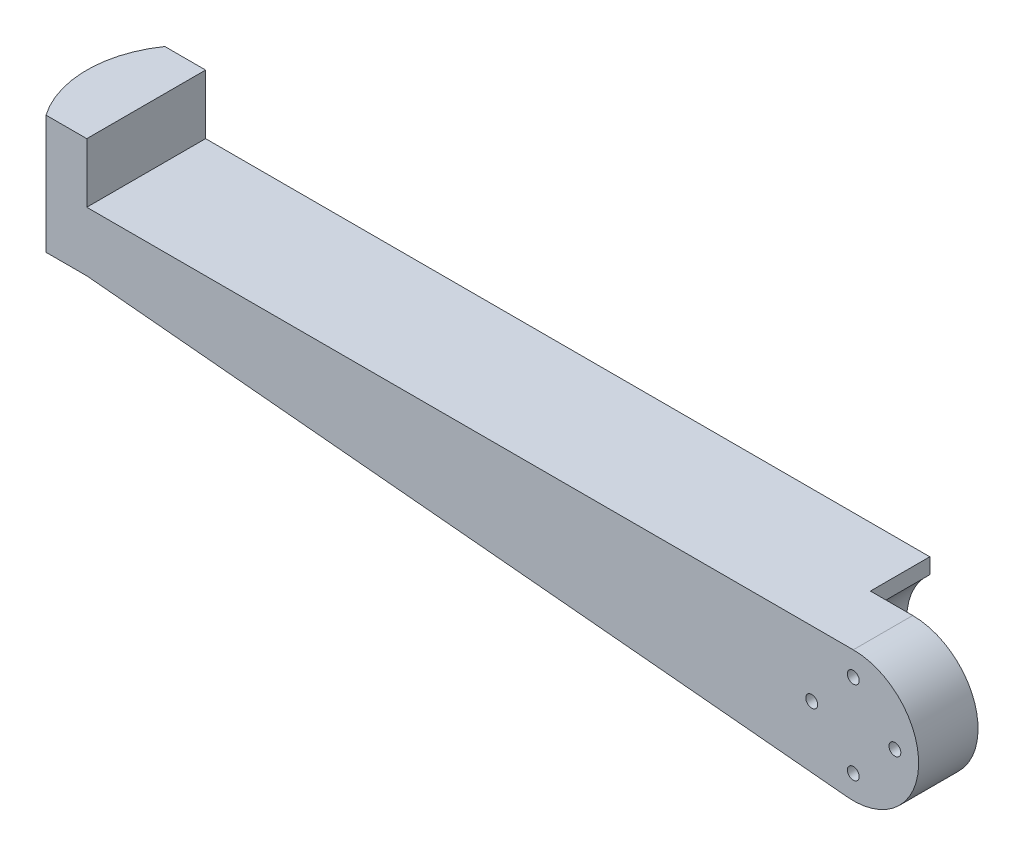
ISO-10303-21;
HEADER;
FILE_DESCRIPTION(('STEP AP214'),'2;1');
FILE_NAME('part.step','',(''),(''),'','','');
FILE_SCHEMA(('AUTOMOTIVE_DESIGN { 1 0 10303 214 1 1 1 1 }'));
ENDSEC;
DATA;
#1=APPLICATION_CONTEXT('core data for automotive mechanical design processes');
#2=APPLICATION_PROTOCOL_DEFINITION('international standard','automotive_design',2000,#1);
#3=PRODUCT_CONTEXT('',#1,'mechanical');
#4=PRODUCT('Part','Part','',(#3));
#5=PRODUCT_RELATED_PRODUCT_CATEGORY('part','',(#4));
#6=PRODUCT_DEFINITION_FORMATION('','',#4);
#7=PRODUCT_DEFINITION_CONTEXT('part definition',#1,'design');
#8=PRODUCT_DEFINITION('design','',#6,#7);
#9=PRODUCT_DEFINITION_SHAPE('','',#8);
#10=(LENGTH_UNIT() NAMED_UNIT(*) SI_UNIT(.MILLI.,.METRE.));
#11=(NAMED_UNIT(*) PLANE_ANGLE_UNIT() SI_UNIT($,.RADIAN.));
#12=(NAMED_UNIT(*) SI_UNIT($,.STERADIAN.) SOLID_ANGLE_UNIT());
#13=UNCERTAINTY_MEASURE_WITH_UNIT(LENGTH_MEASURE(1.E-05),#10,'distance_accuracy_value','');
#14=(GEOMETRIC_REPRESENTATION_CONTEXT(3) GLOBAL_UNCERTAINTY_ASSIGNED_CONTEXT((#13)) GLOBAL_UNIT_ASSIGNED_CONTEXT((#10,
#11,#12)) REPRESENTATION_CONTEXT('',''));
#15=CARTESIAN_POINT('',(0.,0.,0.));
#16=DIRECTION('',(0.,0.,1.));
#17=DIRECTION('',(1.,0.,0.));
#18=AXIS2_PLACEMENT_3D('',#15,#16,#17);
#19=CARTESIAN_POINT('',(-139.,0.999999999999987,-10.));
#20=DIRECTION('',(0.,-1.,0.));
#21=DIRECTION('',(0.,0.,-1.));
#22=AXIS2_PLACEMENT_3D('',#19,#20,#21);
#23=PLANE('',#22);
#24=DIRECTION('',(1.,0.,0.));
#25=VECTOR('',#24,1.);
#26=CARTESIAN_POINT('',(-139.,0.999999999999987,10.));
#27=LINE('',#26,#25);
#28=CARTESIAN_POINT('',(-135.861406616345,0.999999999999987,10.));
#29=VERTEX_POINT('',#28);
#30=CARTESIAN_POINT('',(-129.,0.999999999999987,10.));
#31=VERTEX_POINT('',#30);
#32=EDGE_CURVE('E132',#29,#31,#27,.T.);
#33=ORIENTED_EDGE('',*,*,#32,.F.);
#34=CARTESIAN_POINT('',(-121.5,0.999999999999987,0.));
#35=DIRECTION('',(0.,-1.,0.));
#36=DIRECTION('',(0.,0.,-1.));
#37=AXIS2_PLACEMENT_3D('',#34,#35,#36);
#38=CIRCLE('',#37,17.5);
#39=CARTESIAN_POINT('',(-135.861406616345,0.999999999999987,-10.));
#40=VERTEX_POINT('',#39);
#41=EDGE_CURVE('E120',#29,#40,#38,.T.);
#42=ORIENTED_EDGE('',*,*,#41,.T.);
#43=DIRECTION('',(1.,0.,0.));
#44=VECTOR('',#43,1.);
#45=CARTESIAN_POINT('',(-139.,0.999999999999987,-10.));
#46=LINE('',#45,#44);
#47=CARTESIAN_POINT('',(-129.,0.999999999999987,-10.));
#48=VERTEX_POINT('',#47);
#49=EDGE_CURVE('E228',#40,#48,#46,.T.);
#50=ORIENTED_EDGE('',*,*,#49,.T.);
#51=DIRECTION('',(0.,0.,1.));
#52=VECTOR('',#51,1.);
#53=CARTESIAN_POINT('',(-129.,0.999999999999987,-10.));
#54=LINE('',#53,#52);
#55=EDGE_CURVE('E139',#48,#31,#54,.T.);
#56=ORIENTED_EDGE('',*,*,#55,.T.);
#57=EDGE_LOOP('',(#33,#42,#50,#56));
#58=FACE_BOUND('',#57,.T.);
#59=ADVANCED_FACE('F39',(#58),#23,.T.);
#60=CARTESIAN_POINT('',(-129.,21.,-10.));
#61=DIRECTION('',(0.,1.,0.));
#62=DIRECTION('',(-1.,0.,0.));
#63=AXIS2_PLACEMENT_3D('',#60,#61,#62);
#64=PLANE('',#63);
#65=CARTESIAN_POINT('',(-121.5,21.,0.));
#66=DIRECTION('',(0.,-1.,0.));
#67=DIRECTION('',(-1.,0.,0.));
#68=AXIS2_PLACEMENT_3D('',#65,#66,#67);
#69=CIRCLE('',#68,17.5);
#70=CARTESIAN_POINT('',(-135.861406616345,21.,10.));
#71=VERTEX_POINT('',#70);
#72=CARTESIAN_POINT('',(-135.861406616345,21.,-10.));
#73=VERTEX_POINT('',#72);
#74=EDGE_CURVE('E54',#71,#73,#69,.T.);
#75=ORIENTED_EDGE('',*,*,#74,.F.);
#76=DIRECTION('',(-1.,0.,0.));
#77=VECTOR('',#76,1.);
#78=CARTESIAN_POINT('',(-129.,21.,10.));
#79=LINE('',#78,#77);
#80=CARTESIAN_POINT('',(-129.,21.,10.));
#81=VERTEX_POINT('',#80);
#82=EDGE_CURVE('E136',#81,#71,#79,.T.);
#83=ORIENTED_EDGE('',*,*,#82,.F.);
#84=DIRECTION('',(0.,0.,1.));
#85=VECTOR('',#84,1.);
#86=CARTESIAN_POINT('',(-129.,21.,-10.));
#87=LINE('',#86,#85);
#88=CARTESIAN_POINT('',(-129.,21.,-10.));
#89=VERTEX_POINT('',#88);
#90=EDGE_CURVE('E151',#89,#81,#87,.T.);
#91=ORIENTED_EDGE('',*,*,#90,.F.);
#92=DIRECTION('',(-1.,0.,0.));
#93=VECTOR('',#92,1.);
#94=CARTESIAN_POINT('',(-129.,21.,-10.));
#95=LINE('',#94,#93);
#96=EDGE_CURVE('E225',#89,#73,#95,.T.);
#97=ORIENTED_EDGE('',*,*,#96,.T.);
#98=EDGE_LOOP('',(#75,#83,#91,#97));
#99=FACE_BOUND('',#98,.T.);
#100=ADVANCED_FACE('F240',(#99),#64,.T.);
#101=CARTESIAN_POINT('',(0.,0.,10.));
#102=DIRECTION('',(0.,0.,1.));
#103=DIRECTION('',(1.,0.,0.));
#104=AXIS2_PLACEMENT_3D('',#101,#102,#103);
#105=PLANE('',#104);
#106=CARTESIAN_POINT('',(0.,-7.,10.));
#107=DIRECTION('',(0.,0.,1.));
#108=DIRECTION('',(1.,0.,0.));
#109=AXIS2_PLACEMENT_3D('',#106,#107,#108);
#110=CIRCLE('',#109,1.);
#111=CARTESIAN_POINT('',(0.999999999999951,-7.,10.));
#112=VERTEX_POINT('',#111);
#113=EDGE_CURVE('E162',#112,#112,#110,.T.);
#114=ORIENTED_EDGE('',*,*,#113,.F.);
#115=EDGE_LOOP('',(#114));
#116=FACE_BOUND('',#115,.T.);
#117=CARTESIAN_POINT('',(0.,7.,10.));
#118=DIRECTION('',(0.,0.,1.));
#119=DIRECTION('',(1.,0.,0.));
#120=AXIS2_PLACEMENT_3D('',#117,#118,#119);
#121=CIRCLE('',#120,1.);
#122=CARTESIAN_POINT('',(1.,7.,10.));
#123=VERTEX_POINT('',#122);
#124=EDGE_CURVE('E174',#123,#123,#121,.T.);
#125=ORIENTED_EDGE('',*,*,#124,.F.);
#126=EDGE_LOOP('',(#125));
#127=FACE_BOUND('',#126,.T.);
#128=CARTESIAN_POINT('',(7.,0.,10.));
#129=DIRECTION('',(0.,0.,1.));
#130=DIRECTION('',(1.,0.,0.));
#131=AXIS2_PLACEMENT_3D('',#128,#129,#130);
#132=CIRCLE('',#131,1.);
#133=CARTESIAN_POINT('',(8.,0.,10.));
#134=VERTEX_POINT('',#133);
#135=EDGE_CURVE('E168',#134,#134,#132,.T.);
#136=ORIENTED_EDGE('',*,*,#135,.F.);
#137=EDGE_LOOP('',(#136));
#138=FACE_BOUND('',#137,.T.);
#139=CARTESIAN_POINT('',(-7.,0.,10.));
#140=DIRECTION('',(0.,0.,1.));
#141=DIRECTION('',(1.,0.,0.));
#142=AXIS2_PLACEMENT_3D('',#139,#140,#141);
#143=CIRCLE('',#142,1.);
#144=CARTESIAN_POINT('',(-6.,0.,10.));
#145=VERTEX_POINT('',#144);
#146=EDGE_CURVE('E156',#145,#145,#143,.T.);
#147=ORIENTED_EDGE('',*,*,#146,.F.);
#148=EDGE_LOOP('',(#147));
#149=FACE_BOUND('',#148,.T.);
#150=ORIENTED_EDGE('',*,*,#82,.T.);
#151=DIRECTION('',(0.,1.,0.));
#152=VECTOR('',#151,1.);
#153=CARTESIAN_POINT('',(-135.861406616345,-9.48097173109072,10.));
#154=LINE('',#153,#152);
#155=EDGE_CURVE('E123',#29,#71,#154,.T.);
#156=ORIENTED_EDGE('',*,*,#155,.F.);
#157=ORIENTED_EDGE('',*,*,#32,.T.);
#158=DIRECTION('',(0.995667073768571,-0.092989667238516,0.));
#159=VECTOR('',#158,1.);
#160=CARTESIAN_POINT('',(-129.,0.999999999999987,10.));
#161=LINE('',#160,#159);
#162=CARTESIAN_POINT('',(-1.02288633962367,-10.9523378114543,10.));
#163=VERTEX_POINT('',#162);
#164=EDGE_CURVE('E141',#31,#163,#161,.T.);
#165=ORIENTED_EDGE('',*,*,#164,.T.);
#166=CARTESIAN_POINT('',(0.,0.,10.));
#167=DIRECTION('',(0.,0.,1.));
#168=DIRECTION('',(1.,0.,0.));
#169=AXIS2_PLACEMENT_3D('',#166,#167,#168);
#170=CIRCLE('',#169,11.);
#171=CARTESIAN_POINT('',(0.,11.,10.));
#172=VERTEX_POINT('',#171);
#173=EDGE_CURVE('E180',#163,#172,#170,.T.);
#174=ORIENTED_EDGE('',*,*,#173,.T.);
#175=DIRECTION('',(-1.,0.,0.));
#176=VECTOR('',#175,1.);
#177=CARTESIAN_POINT('',(0.,11.,10.));
#178=LINE('',#177,#176);
#179=CARTESIAN_POINT('',(-129.,11.,10.));
#180=VERTEX_POINT('',#179);
#181=EDGE_CURVE('E194',#172,#180,#178,.T.);
#182=ORIENTED_EDGE('',*,*,#181,.T.);
#183=DIRECTION('',(0.,1.,0.));
#184=VECTOR('',#183,1.);
#185=CARTESIAN_POINT('',(-129.,11.,10.));
#186=LINE('',#185,#184);
#187=EDGE_CURVE('E145',#180,#81,#186,.T.);
#188=ORIENTED_EDGE('',*,*,#187,.T.);
#189=EDGE_LOOP('',(#150,#156,#157,#165,#174,#182,#188));
#190=FACE_BOUND('',#189,.T.);
#191=ADVANCED_FACE('F131',(#116,#127,#138,#149,#190),#105,.T.);
#192=CARTESIAN_POINT('',(0.,0.,0.));
#193=DIRECTION('',(0.,0.,1.));
#194=DIRECTION('',(1.,0.,0.));
#195=AXIS2_PLACEMENT_3D('',#192,#193,#194);
#196=PLANE('',#195);
#197=CARTESIAN_POINT('',(0.,0.,0.));
#198=DIRECTION('',(0.,0.,1.));
#199=DIRECTION('',(1.,0.,0.));
#200=AXIS2_PLACEMENT_3D('',#197,#198,#199);
#201=CIRCLE('',#200,11.);
#202=CARTESIAN_POINT('',(-7.12256812039605,8.38266206943343,0.));
#203=VERTEX_POINT('',#202);
#204=CARTESIAN_POINT('',(-7.12256812039605,-8.38266206943343,0.));
#205=VERTEX_POINT('',#204);
#206=EDGE_CURVE('E183',#203,#205,#201,.T.);
#207=ORIENTED_EDGE('',*,*,#206,.F.);
#208=DIRECTION('',(0.,1.,0.));
#209=VECTOR('',#208,1.);
#210=CARTESIAN_POINT('',(-7.12256812039605,11.,0.));
#211=LINE('',#210,#209);
#212=CARTESIAN_POINT('',(-7.12256812039605,11.,0.));
#213=VERTEX_POINT('',#212);
#214=EDGE_CURVE('E207',#203,#213,#211,.T.);
#215=ORIENTED_EDGE('',*,*,#214,.T.);
#216=DIRECTION('',(1.,0.,0.));
#217=VECTOR('',#216,1.);
#218=CARTESIAN_POINT('',(0.,11.,0.));
#219=LINE('',#218,#217);
#220=CARTESIAN_POINT('',(0.,11.,0.));
#221=VERTEX_POINT('',#220);
#222=EDGE_CURVE('E192',#213,#221,#219,.T.);
#223=ORIENTED_EDGE('',*,*,#222,.T.);
#224=CARTESIAN_POINT('',(-1.02288633962367,-10.9523378114543,0.));
#225=VERTEX_POINT('',#224);
#226=EDGE_CURVE('E177',#225,#221,#201,.T.);
#227=ORIENTED_EDGE('',*,*,#226,.F.);
#228=DIRECTION('',(-0.995667073768572,0.0929896672385145,0.));
#229=VECTOR('',#228,1.);
#230=CARTESIAN_POINT('',(-1.02288633962367,-10.9523378114543,0.));
#231=LINE('',#230,#229);
#232=CARTESIAN_POINT('',(-7.12256812039605,-10.3826620694334,0.));
#233=VERTEX_POINT('',#232);
#234=EDGE_CURVE('E205',#225,#233,#231,.T.);
#235=ORIENTED_EDGE('',*,*,#234,.T.);
#236=DIRECTION('',(0.,1.,0.));
#237=VECTOR('',#236,1.);
#238=CARTESIAN_POINT('',(-7.12256812039605,-8.38266206943343,0.));
#239=LINE('',#238,#237);
#240=EDGE_CURVE('E246',#233,#205,#239,.T.);
#241=ORIENTED_EDGE('',*,*,#240,.T.);
#242=EDGE_LOOP('',(#207,#215,#223,#227,#235,#241));
#243=FACE_BOUND('',#242,.T.);
#244=CARTESIAN_POINT('',(0.,7.,0.));
#245=DIRECTION('',(0.,0.,1.));
#246=DIRECTION('',(1.,0.,0.));
#247=AXIS2_PLACEMENT_3D('',#244,#245,#246);
#248=CIRCLE('',#247,1.);
#249=CARTESIAN_POINT('',(1.,7.,0.));
#250=VERTEX_POINT('',#249);
#251=EDGE_CURVE('E171',#250,#250,#248,.T.);
#252=ORIENTED_EDGE('',*,*,#251,.T.);
#253=EDGE_LOOP('',(#252));
#254=FACE_BOUND('',#253,.T.);
#255=CARTESIAN_POINT('',(7.,0.,0.));
#256=DIRECTION('',(0.,0.,1.));
#257=DIRECTION('',(1.,0.,0.));
#258=AXIS2_PLACEMENT_3D('',#255,#256,#257);
#259=CIRCLE('',#258,1.);
#260=CARTESIAN_POINT('',(8.,0.,0.));
#261=VERTEX_POINT('',#260);
#262=EDGE_CURVE('E165',#261,#261,#259,.T.);
#263=ORIENTED_EDGE('',*,*,#262,.T.);
#264=EDGE_LOOP('',(#263));
#265=FACE_BOUND('',#264,.T.);
#266=CARTESIAN_POINT('',(0.,-7.,0.));
#267=DIRECTION('',(0.,0.,1.));
#268=DIRECTION('',(1.,0.,0.));
#269=AXIS2_PLACEMENT_3D('',#266,#267,#268);
#270=CIRCLE('',#269,1.);
#271=CARTESIAN_POINT('',(0.999999999999951,-7.,0.));
#272=VERTEX_POINT('',#271);
#273=EDGE_CURVE('E159',#272,#272,#270,.T.);
#274=ORIENTED_EDGE('',*,*,#273,.T.);
#275=EDGE_LOOP('',(#274));
#276=FACE_BOUND('',#275,.T.);
#277=CARTESIAN_POINT('',(-7.,0.,0.));
#278=DIRECTION('',(0.,0.,1.));
#279=DIRECTION('',(1.,0.,0.));
#280=AXIS2_PLACEMENT_3D('',#277,#278,#279);
#281=CIRCLE('',#280,1.);
#282=CARTESIAN_POINT('',(-6.,0.,0.));
#283=VERTEX_POINT('',#282);
#284=EDGE_CURVE('E150',#283,#283,#281,.T.);
#285=ORIENTED_EDGE('',*,*,#284,.T.);
#286=EDGE_LOOP('',(#285));
#287=FACE_BOUND('',#286,.T.);
#288=ADVANCED_FACE('F202',(#243,#254,#265,#276,#287),#196,.F.);
#289=CARTESIAN_POINT('',(0.,0.,10.));
#290=DIRECTION('',(0.,0.,-1.));
#291=DIRECTION('',(-1.,0.,0.));
#292=AXIS2_PLACEMENT_3D('',#289,#290,#291);
#293=CYLINDRICAL_SURFACE('',#292,11.);
#294=ORIENTED_EDGE('',*,*,#173,.F.);
#295=DIRECTION('',(0.,0.,-1.));
#296=VECTOR('',#295,1.);
#297=CARTESIAN_POINT('',(-1.02288633962368,-10.9523378114543,10.));
#298=LINE('',#297,#296);
#299=EDGE_CURVE('E11',#163,#225,#298,.T.);
#300=ORIENTED_EDGE('',*,*,#299,.T.);
#301=ORIENTED_EDGE('',*,*,#226,.T.);
#302=DIRECTION('',(0.,0.,-1.));
#303=VECTOR('',#302,1.);
#304=CARTESIAN_POINT('',(0.,11.,10.));
#305=LINE('',#304,#303);
#306=EDGE_CURVE('E47',#172,#221,#305,.T.);
#307=ORIENTED_EDGE('',*,*,#306,.F.);
#308=EDGE_LOOP('',(#294,#300,#301,#307));
#309=FACE_BOUND('',#308,.T.);
#310=ADVANCED_FACE('F41',(#309),#293,.T.);
#311=CARTESIAN_POINT('',(0.,7.,10.));
#312=DIRECTION('',(0.,0.,-1.));
#313=DIRECTION('',(-1.,0.,0.));
#314=AXIS2_PLACEMENT_3D('',#311,#312,#313);
#315=CYLINDRICAL_SURFACE('',#314,1.);
#316=ORIENTED_EDGE('',*,*,#124,.T.);
#317=EDGE_LOOP('',(#316));
#318=FACE_BOUND('',#317,.T.);
#319=ORIENTED_EDGE('',*,*,#251,.F.);
#320=EDGE_LOOP('',(#319));
#321=FACE_BOUND('',#320,.T.);
#322=ADVANCED_FACE('F298',(#318,#321),#315,.F.);
#323=CARTESIAN_POINT('',(7.,0.,10.));
#324=DIRECTION('',(0.,0.,-1.));
#325=DIRECTION('',(-1.,0.,0.));
#326=AXIS2_PLACEMENT_3D('',#323,#324,#325);
#327=CYLINDRICAL_SURFACE('',#326,1.);
#328=ORIENTED_EDGE('',*,*,#135,.T.);
#329=EDGE_LOOP('',(#328));
#330=FACE_BOUND('',#329,.T.);
#331=ORIENTED_EDGE('',*,*,#262,.F.);
#332=EDGE_LOOP('',(#331));
#333=FACE_BOUND('',#332,.T.);
#334=ADVANCED_FACE('F294',(#330,#333),#327,.F.);
#335=CARTESIAN_POINT('',(0.,-7.,10.));
#336=DIRECTION('',(0.,0.,-1.));
#337=DIRECTION('',(-1.,0.,0.));
#338=AXIS2_PLACEMENT_3D('',#335,#336,#337);
#339=CYLINDRICAL_SURFACE('',#338,1.);
#340=ORIENTED_EDGE('',*,*,#113,.T.);
#341=EDGE_LOOP('',(#340));
#342=FACE_BOUND('',#341,.T.);
#343=ORIENTED_EDGE('',*,*,#273,.F.);
#344=EDGE_LOOP('',(#343));
#345=FACE_BOUND('',#344,.T.);
#346=ADVANCED_FACE('F290',(#342,#345),#339,.F.);
#347=CARTESIAN_POINT('',(-7.,0.,10.));
#348=DIRECTION('',(0.,0.,-1.));
#349=DIRECTION('',(-1.,0.,0.));
#350=AXIS2_PLACEMENT_3D('',#347,#348,#349);
#351=CYLINDRICAL_SURFACE('',#350,1.);
#352=ORIENTED_EDGE('',*,*,#146,.T.);
#353=EDGE_LOOP('',(#352));
#354=FACE_BOUND('',#353,.T.);
#355=ORIENTED_EDGE('',*,*,#284,.F.);
#356=EDGE_LOOP('',(#355));
#357=FACE_BOUND('',#356,.T.);
#358=ADVANCED_FACE('F287',(#354,#357),#351,.F.);
#359=CARTESIAN_POINT('',(0.,0.,-10.));
#360=DIRECTION('',(0.,0.,1.));
#361=DIRECTION('',(1.,0.,0.));
#362=AXIS2_PLACEMENT_3D('',#359,#360,#361);
#363=CYLINDRICAL_SURFACE('',#362,11.);
#364=DIRECTION('',(0.,0.,-1.));
#365=VECTOR('',#364,1.);
#366=CARTESIAN_POINT('',(-7.12256812039605,-8.38266206943343,7.58824317431015));
#367=LINE('',#366,#365);
#368=CARTESIAN_POINT('',(-7.12256812039605,-8.38266206943343,-10.));
#369=VERTEX_POINT('',#368);
#370=EDGE_CURVE('E232',#205,#369,#367,.T.);
#371=ORIENTED_EDGE('',*,*,#370,.T.);
#372=CARTESIAN_POINT('',(0.,0.,-10.));
#373=DIRECTION('',(0.,0.,-1.));
#374=DIRECTION('',(1.,0.,0.));
#375=AXIS2_PLACEMENT_3D('',#372,#373,#374);
#376=CIRCLE('',#375,11.);
#377=CARTESIAN_POINT('',(-7.12256812039605,8.38266206943343,-10.));
#378=VERTEX_POINT('',#377);
#379=EDGE_CURVE('E143',#369,#378,#376,.T.);
#380=ORIENTED_EDGE('',*,*,#379,.T.);
#381=DIRECTION('',(0.,0.,-1.));
#382=VECTOR('',#381,1.);
#383=CARTESIAN_POINT('',(-7.12256812039605,8.38266206943343,7.58824317431015));
#384=LINE('',#383,#382);
#385=EDGE_CURVE('E209',#203,#378,#384,.T.);
#386=ORIENTED_EDGE('',*,*,#385,.F.);
#387=ORIENTED_EDGE('',*,*,#206,.T.);
#388=EDGE_LOOP('',(#371,#380,#386,#387));
#389=FACE_BOUND('',#388,.T.);
#390=ADVANCED_FACE('F252',(#389),#363,.F.);
#391=CARTESIAN_POINT('',(-129.,0.999999999999987,-10.));
#392=DIRECTION('',(-0.092989667238516,-0.995667073768572,0.));
#393=DIRECTION('',(0.995667073768572,-0.092989667238516,0.));
#394=AXIS2_PLACEMENT_3D('',#391,#392,#393);
#395=PLANE('',#394);
#396=ORIENTED_EDGE('',*,*,#234,.F.);
#397=ORIENTED_EDGE('',*,*,#299,.F.);
#398=ORIENTED_EDGE('',*,*,#164,.F.);
#399=ORIENTED_EDGE('',*,*,#55,.F.);
#400=DIRECTION('',(0.995667073768571,-0.092989667238516,0.));
#401=VECTOR('',#400,1.);
#402=CARTESIAN_POINT('',(-129.,0.999999999999987,-10.));
#403=LINE('',#402,#401);
#404=CARTESIAN_POINT('',(-7.12256812039605,-10.3826620694334,-10.));
#405=VERTEX_POINT('',#404);
#406=EDGE_CURVE('E155',#48,#405,#403,.T.);
#407=ORIENTED_EDGE('',*,*,#406,.T.);
#408=DIRECTION('',(0.,0.,-1.));
#409=VECTOR('',#408,1.);
#410=CARTESIAN_POINT('',(-7.12256812039605,-10.3826620694334,7.58824317431015));
#411=LINE('',#410,#409);
#412=EDGE_CURVE('E62',#233,#405,#411,.T.);
#413=ORIENTED_EDGE('',*,*,#412,.F.);
#414=EDGE_LOOP('',(#396,#397,#398,#399,#407,#413));
#415=FACE_BOUND('',#414,.T.);
#416=ADVANCED_FACE('F278',(#415),#395,.T.);
#417=CARTESIAN_POINT('',(-129.,11.,-10.));
#418=DIRECTION('',(1.,0.,0.));
#419=DIRECTION('',(0.,0.,-1.));
#420=AXIS2_PLACEMENT_3D('',#417,#418,#419);
#421=PLANE('',#420);
#422=ORIENTED_EDGE('',*,*,#187,.F.);
#423=DIRECTION('',(0.,0.,1.));
#424=VECTOR('',#423,1.);
#425=CARTESIAN_POINT('',(-129.,11.,-10.));
#426=LINE('',#425,#424);
#427=CARTESIAN_POINT('',(-129.,11.,-10.));
#428=VERTEX_POINT('',#427);
#429=EDGE_CURVE('E153',#428,#180,#426,.T.);
#430=ORIENTED_EDGE('',*,*,#429,.F.);
#431=DIRECTION('',(0.,1.,0.));
#432=VECTOR('',#431,1.);
#433=CARTESIAN_POINT('',(-129.,11.,-10.));
#434=LINE('',#433,#432);
#435=EDGE_CURVE('E222',#428,#89,#434,.T.);
#436=ORIENTED_EDGE('',*,*,#435,.T.);
#437=ORIENTED_EDGE('',*,*,#90,.T.);
#438=EDGE_LOOP('',(#422,#430,#436,#437));
#439=FACE_BOUND('',#438,.T.);
#440=ADVANCED_FACE('F236',(#439),#421,.T.);
#441=CARTESIAN_POINT('',(0.,11.,-10.));
#442=DIRECTION('',(0.,1.,0.));
#443=DIRECTION('',(-1.,0.,0.));
#444=AXIS2_PLACEMENT_3D('',#441,#442,#443);
#445=PLANE('',#444);
#446=ORIENTED_EDGE('',*,*,#222,.F.);
#447=DIRECTION('',(0.,0.,-1.));
#448=VECTOR('',#447,1.);
#449=CARTESIAN_POINT('',(-7.12256812039605,11.,7.58824317431015));
#450=LINE('',#449,#448);
#451=CARTESIAN_POINT('',(-7.12256812039605,11.,-10.));
#452=VERTEX_POINT('',#451);
#453=EDGE_CURVE('E208',#213,#452,#450,.T.);
#454=ORIENTED_EDGE('',*,*,#453,.T.);
#455=DIRECTION('',(-1.,0.,0.));
#456=VECTOR('',#455,1.);
#457=CARTESIAN_POINT('',(0.,11.,-10.));
#458=LINE('',#457,#456);
#459=EDGE_CURVE('E220',#452,#428,#458,.T.);
#460=ORIENTED_EDGE('',*,*,#459,.T.);
#461=ORIENTED_EDGE('',*,*,#429,.T.);
#462=ORIENTED_EDGE('',*,*,#181,.F.);
#463=ORIENTED_EDGE('',*,*,#306,.T.);
#464=EDGE_LOOP('',(#446,#454,#460,#461,#462,#463));
#465=FACE_BOUND('',#464,.T.);
#466=ADVANCED_FACE('F190',(#465),#445,.T.);
#467=CARTESIAN_POINT('',(0.,0.,-10.));
#468=DIRECTION('',(0.,0.,1.));
#469=DIRECTION('',(1.,0.,0.));
#470=AXIS2_PLACEMENT_3D('',#467,#468,#469);
#471=PLANE('',#470);
#472=ORIENTED_EDGE('',*,*,#49,.F.);
#473=DIRECTION('',(0.,1.,0.));
#474=VECTOR('',#473,1.);
#475=CARTESIAN_POINT('',(-135.861406616345,-9.48097173109072,-10.));
#476=LINE('',#475,#474);
#477=EDGE_CURVE('E125',#40,#73,#476,.T.);
#478=ORIENTED_EDGE('',*,*,#477,.T.);
#479=ORIENTED_EDGE('',*,*,#96,.F.);
#480=ORIENTED_EDGE('',*,*,#435,.F.);
#481=ORIENTED_EDGE('',*,*,#459,.F.);
#482=DIRECTION('',(0.,1.,0.));
#483=VECTOR('',#482,1.);
#484=CARTESIAN_POINT('',(-7.12256812039605,11.,-10.));
#485=LINE('',#484,#483);
#486=EDGE_CURVE('E215',#378,#452,#485,.T.);
#487=ORIENTED_EDGE('',*,*,#486,.F.);
#488=ORIENTED_EDGE('',*,*,#379,.F.);
#489=DIRECTION('',(0.,1.,0.));
#490=VECTOR('',#489,1.);
#491=CARTESIAN_POINT('',(-7.12256812039605,-8.38266206943343,-10.));
#492=LINE('',#491,#490);
#493=EDGE_CURVE('E217',#405,#369,#492,.T.);
#494=ORIENTED_EDGE('',*,*,#493,.F.);
#495=ORIENTED_EDGE('',*,*,#406,.F.);
#496=EDGE_LOOP('',(#472,#478,#479,#480,#481,#487,#488,#494,#495));
#497=FACE_BOUND('',#496,.T.);
#498=ADVANCED_FACE('F256',(#497),#471,.F.);
#499=CARTESIAN_POINT('',(-7.12256812039605,11.,7.58824317431015));
#500=DIRECTION('',(-1.,0.,0.));
#501=DIRECTION('',(0.,-1.,0.));
#502=AXIS2_PLACEMENT_3D('',#499,#500,#501);
#503=PLANE('',#502);
#504=ORIENTED_EDGE('',*,*,#385,.T.);
#505=ORIENTED_EDGE('',*,*,#486,.T.);
#506=ORIENTED_EDGE('',*,*,#453,.F.);
#507=ORIENTED_EDGE('',*,*,#214,.F.);
#508=EDGE_LOOP('',(#504,#505,#506,#507));
#509=FACE_BOUND('',#508,.T.);
#510=ADVANCED_FACE('F260',(#509),#503,.F.);
#511=CARTESIAN_POINT('',(-7.12256812039605,-8.38266206943343,7.58824317431015));
#512=DIRECTION('',(-1.,0.,0.));
#513=DIRECTION('',(0.,0.,1.));
#514=AXIS2_PLACEMENT_3D('',#511,#512,#513);
#515=PLANE('',#514);
#516=ORIENTED_EDGE('',*,*,#412,.T.);
#517=ORIENTED_EDGE('',*,*,#493,.T.);
#518=ORIENTED_EDGE('',*,*,#370,.F.);
#519=ORIENTED_EDGE('',*,*,#240,.F.);
#520=EDGE_LOOP('',(#516,#517,#518,#519));
#521=FACE_BOUND('',#520,.T.);
#522=ADVANCED_FACE('F261',(#521),#515,.F.);
#523=CARTESIAN_POINT('',(-121.5,-9.48097173109073,0.));
#524=DIRECTION('',(0.,1.,0.));
#525=DIRECTION('',(-1.,0.,0.));
#526=AXIS2_PLACEMENT_3D('',#523,#524,#525);
#527=CYLINDRICAL_SURFACE('',#526,17.5);
#528=ORIENTED_EDGE('',*,*,#41,.F.);
#529=ORIENTED_EDGE('',*,*,#155,.T.);
#530=ORIENTED_EDGE('',*,*,#74,.T.);
#531=ORIENTED_EDGE('',*,*,#477,.F.);
#532=EDGE_LOOP('',(#528,#529,#530,#531));
#533=FACE_BOUND('',#532,.T.);
#534=ADVANCED_FACE('F122',(#533),#527,.T.);
#535=CLOSED_SHELL('',(#59,#100,#191,#288,#310,#322,#334,#346,#358,#390,#416,#440,#466,#498,#510,
#522,#534));
#536=MANIFOLD_SOLID_BREP('B2',#535);
#537=ADVANCED_BREP_SHAPE_REPRESENTATION('',(#18,#536),#14);
#538=SHAPE_DEFINITION_REPRESENTATION(#9,#537);
ENDSEC;
END-ISO-10303-21;
